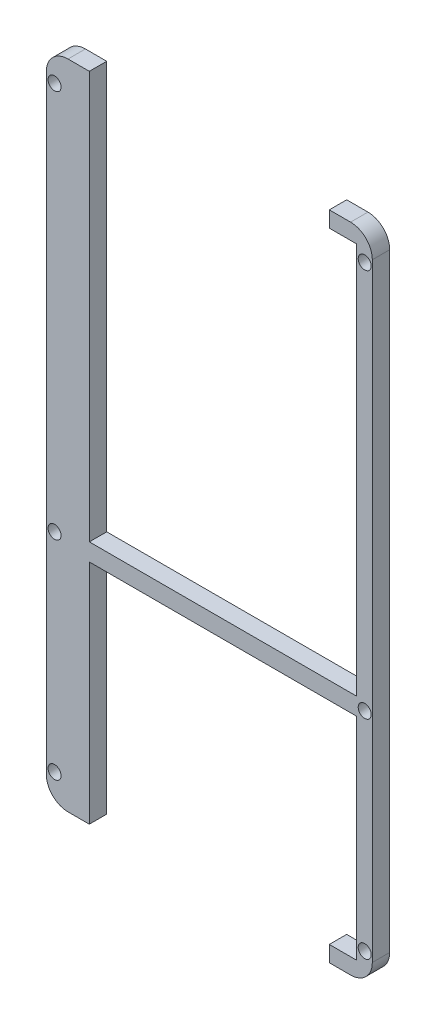
ISO-10303-21;
HEADER;
FILE_DESCRIPTION(('STEP AP214'),'2;1');
FILE_NAME('part.step','',(''),(''),'','','');
FILE_SCHEMA(('AUTOMOTIVE_DESIGN { 1 0 10303 214 1 1 1 1 }'));
ENDSEC;
DATA;
#1=APPLICATION_CONTEXT('core data for automotive mechanical design processes');
#2=APPLICATION_PROTOCOL_DEFINITION('international standard','automotive_design',2000,#1);
#3=PRODUCT_CONTEXT('',#1,'mechanical');
#4=PRODUCT('Part','Part','',(#3));
#5=PRODUCT_RELATED_PRODUCT_CATEGORY('part','',(#4));
#6=PRODUCT_DEFINITION_FORMATION('','',#4);
#7=PRODUCT_DEFINITION_CONTEXT('part definition',#1,'design');
#8=PRODUCT_DEFINITION('design','',#6,#7);
#9=PRODUCT_DEFINITION_SHAPE('','',#8);
#10=(LENGTH_UNIT() NAMED_UNIT(*) SI_UNIT(.MILLI.,.METRE.));
#11=(NAMED_UNIT(*) PLANE_ANGLE_UNIT() SI_UNIT($,.RADIAN.));
#12=(NAMED_UNIT(*) SI_UNIT($,.STERADIAN.) SOLID_ANGLE_UNIT());
#13=UNCERTAINTY_MEASURE_WITH_UNIT(LENGTH_MEASURE(1.E-05),#10,'distance_accuracy_value','');
#14=(GEOMETRIC_REPRESENTATION_CONTEXT(3) GLOBAL_UNCERTAINTY_ASSIGNED_CONTEXT((#13)) GLOBAL_UNIT_ASSIGNED_CONTEXT((#10,
#11,#12)) REPRESENTATION_CONTEXT('',''));
#15=CARTESIAN_POINT('',(0.,0.,0.));
#16=DIRECTION('',(0.,0.,1.));
#17=DIRECTION('',(1.,0.,0.));
#18=AXIS2_PLACEMENT_3D('',#15,#16,#17);
#19=CARTESIAN_POINT('',(-65.6120067040927,-435.,8.));
#20=DIRECTION('',(0.,1.,0.));
#21=DIRECTION('',(0.,0.,1.));
#22=AXIS2_PLACEMENT_3D('',#19,#20,#21);
#23=PLANE('',#22);
#24=DIRECTION('',(1.,0.,0.));
#25=VECTOR('',#24,1.);
#26=CARTESIAN_POINT('',(-65.6120067040927,-435.,8.));
#27=LINE('',#26,#25);
#28=CARTESIAN_POINT('',(-55.6120067040927,-435.,8.));
#29=VERTEX_POINT('',#28);
#30=CARTESIAN_POINT('',(-45.8120067040927,-435.,8.));
#31=VERTEX_POINT('',#30);
#32=EDGE_CURVE('E184',#29,#31,#27,.T.);
#33=ORIENTED_EDGE('',*,*,#32,.F.);
#34=DIRECTION('',(0.,0.,-1.));
#35=VECTOR('',#34,1.);
#36=CARTESIAN_POINT('',(-55.6120067040927,-435.,8.));
#37=LINE('',#36,#35);
#38=CARTESIAN_POINT('',(-55.6120067040927,-435.,0.));
#39=VERTEX_POINT('',#38);
#40=EDGE_CURVE('E248',#29,#39,#37,.T.);
#41=ORIENTED_EDGE('',*,*,#40,.T.);
#42=DIRECTION('',(1.,0.,0.));
#43=VECTOR('',#42,1.);
#44=CARTESIAN_POINT('',(-65.6120067040927,-435.,0.));
#45=LINE('',#44,#43);
#46=CARTESIAN_POINT('',(-45.8120067040927,-435.,0.));
#47=VERTEX_POINT('',#46);
#48=EDGE_CURVE('E209',#39,#47,#45,.T.);
#49=ORIENTED_EDGE('',*,*,#48,.T.);
#50=DIRECTION('',(0.,0.,-1.));
#51=VECTOR('',#50,1.);
#52=CARTESIAN_POINT('',(-45.8120067040927,-435.,8.));
#53=LINE('',#52,#51);
#54=EDGE_CURVE('E202',#31,#47,#53,.T.);
#55=ORIENTED_EDGE('',*,*,#54,.F.);
#56=EDGE_LOOP('',(#33,#41,#49,#55));
#57=FACE_BOUND('',#56,.T.);
#58=ADVANCED_FACE('F41',(#57),#23,.F.);
#59=CARTESIAN_POINT('',(-45.8120067040927,-435.,8.));
#60=DIRECTION('',(-1.,0.,0.));
#61=DIRECTION('',(0.,-1.,0.));
#62=AXIS2_PLACEMENT_3D('',#59,#60,#61);
#63=PLANE('',#62);
#64=DIRECTION('',(0.,1.,0.));
#65=VECTOR('',#64,1.);
#66=CARTESIAN_POINT('',(-45.8120067040927,-435.,0.));
#67=LINE('',#66,#65);
#68=CARTESIAN_POINT('',(-45.8120067040927,-330.5,0.));
#69=VERTEX_POINT('',#68);
#70=EDGE_CURVE('E324',#47,#69,#67,.T.);
#71=ORIENTED_EDGE('',*,*,#70,.T.);
#72=DIRECTION('',(0.,0.,-1.));
#73=VECTOR('',#72,1.);
#74=CARTESIAN_POINT('',(-45.8120067040927,-330.5,8.));
#75=LINE('',#74,#73);
#76=CARTESIAN_POINT('',(-45.8120067040927,-330.5,8.));
#77=VERTEX_POINT('',#76);
#78=EDGE_CURVE('E204',#77,#69,#75,.T.);
#79=ORIENTED_EDGE('',*,*,#78,.F.);
#80=DIRECTION('',(0.,1.,0.));
#81=VECTOR('',#80,1.);
#82=CARTESIAN_POINT('',(-45.8120067040927,-435.,8.));
#83=LINE('',#82,#81);
#84=EDGE_CURVE('E188',#31,#77,#83,.T.);
#85=ORIENTED_EDGE('',*,*,#84,.F.);
#86=ORIENTED_EDGE('',*,*,#54,.T.);
#87=EDGE_LOOP('',(#71,#79,#85,#86));
#88=FACE_BOUND('',#87,.T.);
#89=ADVANCED_FACE('F201',(#88),#63,.F.);
#90=CARTESIAN_POINT('',(-45.8120067040927,-330.5,8.));
#91=DIRECTION('',(0.,1.,0.));
#92=DIRECTION('',(0.,0.,1.));
#93=AXIS2_PLACEMENT_3D('',#90,#91,#92);
#94=PLANE('',#93);
#95=DIRECTION('',(1.,0.,0.));
#96=VECTOR('',#95,1.);
#97=CARTESIAN_POINT('',(-45.8120067040927,-330.5,0.));
#98=LINE('',#97,#96);
#99=CARTESIAN_POINT('',(77.0879932959074,-330.5,0.));
#100=VERTEX_POINT('',#99);
#101=EDGE_CURVE('E318',#69,#100,#98,.T.);
#102=ORIENTED_EDGE('',*,*,#101,.T.);
#103=DIRECTION('',(0.,0.,-1.));
#104=VECTOR('',#103,1.);
#105=CARTESIAN_POINT('',(77.0879932959074,-330.5,8.));
#106=LINE('',#105,#104);
#107=CARTESIAN_POINT('',(77.0879932959074,-330.5,8.));
#108=VERTEX_POINT('',#107);
#109=EDGE_CURVE('E215',#108,#100,#106,.T.);
#110=ORIENTED_EDGE('',*,*,#109,.F.);
#111=DIRECTION('',(1.,0.,0.));
#112=VECTOR('',#111,1.);
#113=CARTESIAN_POINT('',(-45.8120067040927,-330.5,8.));
#114=LINE('',#113,#112);
#115=EDGE_CURVE('E206',#77,#108,#114,.T.);
#116=ORIENTED_EDGE('',*,*,#115,.F.);
#117=ORIENTED_EDGE('',*,*,#78,.T.);
#118=EDGE_LOOP('',(#102,#110,#116,#117));
#119=FACE_BOUND('',#118,.T.);
#120=ADVANCED_FACE('F363',(#119),#94,.F.);
#121=CARTESIAN_POINT('',(77.0879932959074,-330.5,8.));
#122=DIRECTION('',(1.,0.,0.));
#123=DIRECTION('',(0.,0.,-1.));
#124=AXIS2_PLACEMENT_3D('',#121,#122,#123);
#125=PLANE('',#124);
#126=DIRECTION('',(0.,-1.,0.));
#127=VECTOR('',#126,1.);
#128=CARTESIAN_POINT('',(77.0879932959074,-330.5,0.));
#129=LINE('',#128,#127);
#130=CARTESIAN_POINT('',(77.0879932959074,-427.7,0.));
#131=VERTEX_POINT('',#130);
#132=EDGE_CURVE('E313',#100,#131,#129,.T.);
#133=ORIENTED_EDGE('',*,*,#132,.T.);
#134=DIRECTION('',(0.,0.,-1.));
#135=VECTOR('',#134,1.);
#136=CARTESIAN_POINT('',(77.0879932959074,-427.7,8.));
#137=LINE('',#136,#135);
#138=CARTESIAN_POINT('',(77.0879932959074,-427.7,8.));
#139=VERTEX_POINT('',#138);
#140=EDGE_CURVE('E304',#139,#131,#137,.T.);
#141=ORIENTED_EDGE('',*,*,#140,.F.);
#142=DIRECTION('',(0.,-1.,0.));
#143=VECTOR('',#142,1.);
#144=CARTESIAN_POINT('',(77.0879932959074,-330.5,8.));
#145=LINE('',#144,#143);
#146=EDGE_CURVE('E314',#108,#139,#145,.T.);
#147=ORIENTED_EDGE('',*,*,#146,.F.);
#148=ORIENTED_EDGE('',*,*,#109,.T.);
#149=EDGE_LOOP('',(#133,#141,#147,#148));
#150=FACE_BOUND('',#149,.T.);
#151=ADVANCED_FACE('F311',(#150),#125,.F.);
#152=CARTESIAN_POINT('',(77.0879932959074,-427.7,8.));
#153=DIRECTION('',(0.,-1.,0.));
#154=DIRECTION('',(0.,0.,-1.));
#155=AXIS2_PLACEMENT_3D('',#152,#153,#154);
#156=PLANE('',#155);
#157=DIRECTION('',(-1.,0.,0.));
#158=VECTOR('',#157,1.);
#159=CARTESIAN_POINT('',(77.0879932959074,-427.7,0.));
#160=LINE('',#159,#158);
#161=CARTESIAN_POINT('',(64.5879932959074,-427.7,0.));
#162=VERTEX_POINT('',#161);
#163=EDGE_CURVE('E320',#131,#162,#160,.T.);
#164=ORIENTED_EDGE('',*,*,#163,.T.);
#165=DIRECTION('',(0.,0.,-1.));
#166=VECTOR('',#165,1.);
#167=CARTESIAN_POINT('',(64.5879932959074,-427.7,8.));
#168=LINE('',#167,#166);
#169=CARTESIAN_POINT('',(64.5879932959074,-427.7,8.));
#170=VERTEX_POINT('',#169);
#171=EDGE_CURVE('E301',#170,#162,#168,.T.);
#172=ORIENTED_EDGE('',*,*,#171,.F.);
#173=DIRECTION('',(-1.,0.,0.));
#174=VECTOR('',#173,1.);
#175=CARTESIAN_POINT('',(77.0879932959074,-427.7,8.));
#176=LINE('',#175,#174);
#177=EDGE_CURVE('E365',#139,#170,#176,.T.);
#178=ORIENTED_EDGE('',*,*,#177,.F.);
#179=ORIENTED_EDGE('',*,*,#140,.T.);
#180=EDGE_LOOP('',(#164,#172,#178,#179));
#181=FACE_BOUND('',#180,.T.);
#182=ADVANCED_FACE('F398',(#181),#156,.F.);
#183=CARTESIAN_POINT('',(64.5879932959074,-427.7,8.));
#184=DIRECTION('',(1.,0.,0.));
#185=DIRECTION('',(0.,0.,-1.));
#186=AXIS2_PLACEMENT_3D('',#183,#184,#185);
#187=PLANE('',#186);
#188=DIRECTION('',(0.,-1.,0.));
#189=VECTOR('',#188,1.);
#190=CARTESIAN_POINT('',(64.5879932959074,-427.7,0.));
#191=LINE('',#190,#189);
#192=CARTESIAN_POINT('',(64.5879932959074,-435.,0.));
#193=VERTEX_POINT('',#192);
#194=EDGE_CURVE('E322',#162,#193,#191,.T.);
#195=ORIENTED_EDGE('',*,*,#194,.T.);
#196=DIRECTION('',(0.,0.,-1.));
#197=VECTOR('',#196,1.);
#198=CARTESIAN_POINT('',(64.5879932959074,-435.,8.));
#199=LINE('',#198,#197);
#200=CARTESIAN_POINT('',(64.5879932959074,-435.,8.));
#201=VERTEX_POINT('',#200);
#202=EDGE_CURVE('E298',#201,#193,#199,.T.);
#203=ORIENTED_EDGE('',*,*,#202,.F.);
#204=DIRECTION('',(0.,-1.,0.));
#205=VECTOR('',#204,1.);
#206=CARTESIAN_POINT('',(64.5879932959074,-427.7,8.));
#207=LINE('',#206,#205);
#208=EDGE_CURVE('E369',#170,#201,#207,.T.);
#209=ORIENTED_EDGE('',*,*,#208,.F.);
#210=ORIENTED_EDGE('',*,*,#171,.T.);
#211=EDGE_LOOP('',(#195,#203,#209,#210));
#212=FACE_BOUND('',#211,.T.);
#213=ADVANCED_FACE('F394',(#212),#187,.F.);
#214=CARTESIAN_POINT('',(64.5879932959074,-435.,8.));
#215=DIRECTION('',(0.,1.,0.));
#216=DIRECTION('',(0.,0.,1.));
#217=AXIS2_PLACEMENT_3D('',#214,#215,#216);
#218=PLANE('',#217);
#219=DIRECTION('',(1.,0.,0.));
#220=VECTOR('',#219,1.);
#221=CARTESIAN_POINT('',(64.5879932959074,-435.,0.));
#222=LINE('',#221,#220);
#223=CARTESIAN_POINT('',(74.3879932959073,-435.,0.));
#224=VERTEX_POINT('',#223);
#225=EDGE_CURVE('E329',#193,#224,#222,.T.);
#226=ORIENTED_EDGE('',*,*,#225,.T.);
#227=DIRECTION('',(0.,0.,-1.));
#228=VECTOR('',#227,1.);
#229=CARTESIAN_POINT('',(74.3879932959073,-435.,8.));
#230=LINE('',#229,#228);
#231=CARTESIAN_POINT('',(74.3879932959073,-435.,8.));
#232=VERTEX_POINT('',#231);
#233=EDGE_CURVE('E246',#224,#232,#230,.F.);
#234=ORIENTED_EDGE('',*,*,#233,.T.);
#235=DIRECTION('',(1.,0.,0.));
#236=VECTOR('',#235,1.);
#237=CARTESIAN_POINT('',(64.5879932959074,-435.,8.));
#238=LINE('',#237,#236);
#239=EDGE_CURVE('E371',#201,#232,#238,.T.);
#240=ORIENTED_EDGE('',*,*,#239,.F.);
#241=ORIENTED_EDGE('',*,*,#202,.T.);
#242=EDGE_LOOP('',(#226,#234,#240,#241));
#243=FACE_BOUND('',#242,.T.);
#244=ADVANCED_FACE('F389',(#243),#218,.F.);
#245=CARTESIAN_POINT('',(84.3879932959073,-135.,8.));
#246=DIRECTION('',(-1.,0.,0.));
#247=DIRECTION('',(0.,0.,1.));
#248=AXIS2_PLACEMENT_3D('',#245,#246,#247);
#249=PLANE('',#248);
#250=DIRECTION('',(0.,1.,0.));
#251=VECTOR('',#250,1.);
#252=CARTESIAN_POINT('',(84.3879932959073,-135.,0.));
#253=LINE('',#252,#251);
#254=CARTESIAN_POINT('',(84.3879932959073,-425.,0.));
#255=VERTEX_POINT('',#254);
#256=CARTESIAN_POINT('',(84.3879932959073,-145.,0.));
#257=VERTEX_POINT('',#256);
#258=EDGE_CURVE('E332',#255,#257,#253,.T.);
#259=ORIENTED_EDGE('',*,*,#258,.T.);
#260=DIRECTION('',(0.,0.,-1.));
#261=VECTOR('',#260,1.);
#262=CARTESIAN_POINT('',(84.3879932959073,-145.,8.));
#263=LINE('',#262,#261);
#264=CARTESIAN_POINT('',(84.3879932959073,-145.,8.));
#265=VERTEX_POINT('',#264);
#266=EDGE_CURVE('E244',#257,#265,#263,.F.);
#267=ORIENTED_EDGE('',*,*,#266,.T.);
#268=DIRECTION('',(0.,1.,0.));
#269=VECTOR('',#268,1.);
#270=CARTESIAN_POINT('',(84.3879932959073,-135.,8.));
#271=LINE('',#270,#269);
#272=CARTESIAN_POINT('',(84.3879932959073,-425.,8.));
#273=VERTEX_POINT('',#272);
#274=EDGE_CURVE('E350',#273,#265,#271,.T.);
#275=ORIENTED_EDGE('',*,*,#274,.F.);
#276=DIRECTION('',(0.,0.,-1.));
#277=VECTOR('',#276,1.);
#278=CARTESIAN_POINT('',(84.3879932959073,-425.,8.));
#279=LINE('',#278,#277);
#280=EDGE_CURVE('E241',#273,#255,#279,.T.);
#281=ORIENTED_EDGE('',*,*,#280,.T.);
#282=EDGE_LOOP('',(#259,#267,#275,#281));
#283=FACE_BOUND('',#282,.T.);
#284=ADVANCED_FACE('F383',(#283),#249,.F.);
#285=CARTESIAN_POINT('',(64.5879932959074,-135.,8.));
#286=DIRECTION('',(0.,-1.,0.));
#287=DIRECTION('',(0.,0.,-1.));
#288=AXIS2_PLACEMENT_3D('',#285,#286,#287);
#289=PLANE('',#288);
#290=DIRECTION('',(-1.,0.,0.));
#291=VECTOR('',#290,1.);
#292=CARTESIAN_POINT('',(64.5879932959074,-135.,8.));
#293=LINE('',#292,#291);
#294=CARTESIAN_POINT('',(74.3879932959073,-135.,8.));
#295=VERTEX_POINT('',#294);
#296=CARTESIAN_POINT('',(64.5879932959074,-135.,8.));
#297=VERTEX_POINT('',#296);
#298=EDGE_CURVE('E346',#295,#297,#293,.T.);
#299=ORIENTED_EDGE('',*,*,#298,.F.);
#300=DIRECTION('',(0.,0.,-1.));
#301=VECTOR('',#300,1.);
#302=CARTESIAN_POINT('',(74.3879932959073,-135.,8.));
#303=LINE('',#302,#301);
#304=CARTESIAN_POINT('',(74.3879932959073,-135.,0.));
#305=VERTEX_POINT('',#304);
#306=EDGE_CURVE('E238',#295,#305,#303,.T.);
#307=ORIENTED_EDGE('',*,*,#306,.T.);
#308=DIRECTION('',(-1.,0.,0.));
#309=VECTOR('',#308,1.);
#310=CARTESIAN_POINT('',(64.5879932959074,-135.,0.));
#311=LINE('',#310,#309);
#312=CARTESIAN_POINT('',(64.5879932959074,-135.,0.));
#313=VERTEX_POINT('',#312);
#314=EDGE_CURVE('E273',#305,#313,#311,.T.);
#315=ORIENTED_EDGE('',*,*,#314,.T.);
#316=DIRECTION('',(0.,0.,-1.));
#317=VECTOR('',#316,1.);
#318=CARTESIAN_POINT('',(64.5879932959074,-135.,8.));
#319=LINE('',#318,#317);
#320=EDGE_CURVE('E295',#297,#313,#319,.T.);
#321=ORIENTED_EDGE('',*,*,#320,.F.);
#322=EDGE_LOOP('',(#299,#307,#315,#321));
#323=FACE_BOUND('',#322,.T.);
#324=ADVANCED_FACE('F337',(#323),#289,.F.);
#325=CARTESIAN_POINT('',(64.5879932959074,-142.3,8.));
#326=DIRECTION('',(1.,0.,0.));
#327=DIRECTION('',(0.,0.,-1.));
#328=AXIS2_PLACEMENT_3D('',#325,#326,#327);
#329=PLANE('',#328);
#330=DIRECTION('',(0.,-1.,0.));
#331=VECTOR('',#330,1.);
#332=CARTESIAN_POINT('',(64.5879932959074,-142.3,0.));
#333=LINE('',#332,#331);
#334=CARTESIAN_POINT('',(64.5879932959074,-142.3,0.));
#335=VERTEX_POINT('',#334);
#336=EDGE_CURVE('E269',#313,#335,#333,.T.);
#337=ORIENTED_EDGE('',*,*,#336,.T.);
#338=DIRECTION('',(0.,0.,-1.));
#339=VECTOR('',#338,1.);
#340=CARTESIAN_POINT('',(64.5879932959074,-142.3,8.));
#341=LINE('',#340,#339);
#342=CARTESIAN_POINT('',(64.5879932959074,-142.3,8.));
#343=VERTEX_POINT('',#342);
#344=EDGE_CURVE('E293',#343,#335,#341,.T.);
#345=ORIENTED_EDGE('',*,*,#344,.F.);
#346=DIRECTION('',(0.,-1.,0.));
#347=VECTOR('',#346,1.);
#348=CARTESIAN_POINT('',(64.5879932959074,-142.3,8.));
#349=LINE('',#348,#347);
#350=EDGE_CURVE('E343',#297,#343,#349,.T.);
#351=ORIENTED_EDGE('',*,*,#350,.F.);
#352=ORIENTED_EDGE('',*,*,#320,.T.);
#353=EDGE_LOOP('',(#337,#345,#351,#352));
#354=FACE_BOUND('',#353,.T.);
#355=ADVANCED_FACE('F341',(#354),#329,.F.);
#356=CARTESIAN_POINT('',(77.0879932959074,-142.3,8.));
#357=DIRECTION('',(0.,1.,0.));
#358=DIRECTION('',(0.,0.,1.));
#359=AXIS2_PLACEMENT_3D('',#356,#357,#358);
#360=PLANE('',#359);
#361=DIRECTION('',(1.,0.,0.));
#362=VECTOR('',#361,1.);
#363=CARTESIAN_POINT('',(77.0879932959074,-142.3,0.));
#364=LINE('',#363,#362);
#365=CARTESIAN_POINT('',(79.0879932959074,-142.3,0.));
#366=VERTEX_POINT('',#365);
#367=EDGE_CURVE('E64',#335,#366,#364,.T.);
#368=ORIENTED_EDGE('',*,*,#367,.T.);
#369=DIRECTION('',(0.707106781186552,0.,-0.707106781186543));
#370=VECTOR('',#369,1.);
#371=CARTESIAN_POINT('',(74.0879932959074,-142.3,4.99999999999995));
#372=LINE('',#371,#370);
#373=CARTESIAN_POINT('',(77.0879932959074,-142.3,1.99999999999997));
#374=VERTEX_POINT('',#373);
#375=EDGE_CURVE('E11',#366,#374,#372,.F.);
#376=ORIENTED_EDGE('',*,*,#375,.T.);
#377=DIRECTION('',(0.,0.,-1.));
#378=VECTOR('',#377,1.);
#379=CARTESIAN_POINT('',(77.0879932959074,-142.3,8.));
#380=LINE('',#379,#378);
#381=CARTESIAN_POINT('',(77.0879932959074,-142.3,8.));
#382=VERTEX_POINT('',#381);
#383=EDGE_CURVE('E290',#382,#374,#380,.T.);
#384=ORIENTED_EDGE('',*,*,#383,.F.);
#385=DIRECTION('',(1.,0.,0.));
#386=VECTOR('',#385,1.);
#387=CARTESIAN_POINT('',(77.0879932959074,-142.3,8.));
#388=LINE('',#387,#386);
#389=EDGE_CURVE('E345',#343,#382,#388,.T.);
#390=ORIENTED_EDGE('',*,*,#389,.F.);
#391=ORIENTED_EDGE('',*,*,#344,.T.);
#392=EDGE_LOOP('',(#368,#376,#384,#390,#391));
#393=FACE_BOUND('',#392,.T.);
#394=ADVANCED_FACE('F449',(#393),#360,.F.);
#395=CARTESIAN_POINT('',(77.0879932959074,-322.5,8.));
#396=DIRECTION('',(1.,0.,0.));
#397=DIRECTION('',(0.,0.,-1.));
#398=AXIS2_PLACEMENT_3D('',#395,#396,#397);
#399=PLANE('',#398);
#400=ORIENTED_EDGE('',*,*,#383,.T.);
#401=DIRECTION('',(0.,-1.,0.));
#402=VECTOR('',#401,1.);
#403=CARTESIAN_POINT('',(77.0879932959074,-322.5,1.99999999999997));
#404=LINE('',#403,#402);
#405=CARTESIAN_POINT('',(77.0879932959074,-322.5,1.99999999999997));
#406=VERTEX_POINT('',#405);
#407=EDGE_CURVE('E250',#374,#406,#404,.T.);
#408=ORIENTED_EDGE('',*,*,#407,.T.);
#409=DIRECTION('',(0.,0.,-1.));
#410=VECTOR('',#409,1.);
#411=CARTESIAN_POINT('',(77.0879932959074,-322.5,8.));
#412=LINE('',#411,#410);
#413=CARTESIAN_POINT('',(77.0879932959074,-322.5,8.));
#414=VERTEX_POINT('',#413);
#415=EDGE_CURVE('E262',#414,#406,#412,.T.);
#416=ORIENTED_EDGE('',*,*,#415,.F.);
#417=DIRECTION('',(0.,-1.,0.));
#418=VECTOR('',#417,1.);
#419=CARTESIAN_POINT('',(77.0879932959074,-154.8,8.));
#420=LINE('',#419,#418);
#421=EDGE_CURVE('E348',#382,#414,#420,.T.);
#422=ORIENTED_EDGE('',*,*,#421,.F.);
#423=EDGE_LOOP('',(#400,#408,#416,#422));
#424=FACE_BOUND('',#423,.T.);
#425=ADVANCED_FACE('F448',(#424),#399,.F.);
#426=CARTESIAN_POINT('',(-45.8120067040927,-322.5,8.));
#427=DIRECTION('',(0.,-1.,0.));
#428=DIRECTION('',(0.,0.,-1.));
#429=AXIS2_PLACEMENT_3D('',#426,#427,#428);
#430=PLANE('',#429);
#431=DIRECTION('',(-1.,0.,0.));
#432=VECTOR('',#431,1.);
#433=CARTESIAN_POINT('',(-45.8120067040927,-322.5,0.));
#434=LINE('',#433,#432);
#435=CARTESIAN_POINT('',(79.0879932959074,-322.5,0.));
#436=VERTEX_POINT('',#435);
#437=CARTESIAN_POINT('',(-45.8120067040927,-322.5,0.));
#438=VERTEX_POINT('',#437);
#439=EDGE_CURVE('E57',#436,#438,#434,.T.);
#440=ORIENTED_EDGE('',*,*,#439,.T.);
#441=DIRECTION('',(0.,0.,-1.));
#442=VECTOR('',#441,1.);
#443=CARTESIAN_POINT('',(-45.8120067040927,-322.5,8.));
#444=LINE('',#443,#442);
#445=CARTESIAN_POINT('',(-45.8120067040927,-322.5,8.));
#446=VERTEX_POINT('',#445);
#447=EDGE_CURVE('E286',#446,#438,#444,.T.);
#448=ORIENTED_EDGE('',*,*,#447,.F.);
#449=DIRECTION('',(-1.,0.,0.));
#450=VECTOR('',#449,1.);
#451=CARTESIAN_POINT('',(-45.8120067040927,-322.5,8.));
#452=LINE('',#451,#450);
#453=EDGE_CURVE('E355',#414,#446,#452,.T.);
#454=ORIENTED_EDGE('',*,*,#453,.F.);
#455=ORIENTED_EDGE('',*,*,#415,.T.);
#456=DIRECTION('',(-0.707106781186552,0.,0.707106781186543));
#457=VECTOR('',#456,1.);
#458=CARTESIAN_POINT('',(12.6379932959065,-322.5,66.45));
#459=LINE('',#458,#457);
#460=EDGE_CURVE('E50',#406,#436,#459,.F.);
#461=ORIENTED_EDGE('',*,*,#460,.T.);
#462=EDGE_LOOP('',(#440,#448,#454,#455,#461));
#463=FACE_BOUND('',#462,.T.);
#464=ADVANCED_FACE('F257',(#463),#430,.F.);
#465=CARTESIAN_POINT('',(-45.8120067040927,-135.,8.));
#466=DIRECTION('',(-1.,0.,0.));
#467=DIRECTION('',(0.,-1.,0.));
#468=AXIS2_PLACEMENT_3D('',#465,#466,#467);
#469=PLANE('',#468);
#470=DIRECTION('',(0.,1.,0.));
#471=VECTOR('',#470,1.);
#472=CARTESIAN_POINT('',(-45.8120067040927,-135.,0.));
#473=LINE('',#472,#471);
#474=CARTESIAN_POINT('',(-45.8120067040927,-135.,0.));
#475=VERTEX_POINT('',#474);
#476=EDGE_CURVE('E271',#438,#475,#473,.T.);
#477=ORIENTED_EDGE('',*,*,#476,.T.);
#478=DIRECTION('',(0.,0.,-1.));
#479=VECTOR('',#478,1.);
#480=CARTESIAN_POINT('',(-45.8120067040927,-135.,8.));
#481=LINE('',#480,#479);
#482=CARTESIAN_POINT('',(-45.8120067040927,-135.,8.));
#483=VERTEX_POINT('',#482);
#484=EDGE_CURVE('E283',#483,#475,#481,.T.);
#485=ORIENTED_EDGE('',*,*,#484,.F.);
#486=DIRECTION('',(0.,1.,0.));
#487=VECTOR('',#486,1.);
#488=CARTESIAN_POINT('',(-45.8120067040927,-135.,8.));
#489=LINE('',#488,#487);
#490=EDGE_CURVE('E357',#446,#483,#489,.T.);
#491=ORIENTED_EDGE('',*,*,#490,.F.);
#492=ORIENTED_EDGE('',*,*,#447,.T.);
#493=EDGE_LOOP('',(#477,#485,#491,#492));
#494=FACE_BOUND('',#493,.T.);
#495=ADVANCED_FACE('F444',(#494),#469,.F.);
#496=CARTESIAN_POINT('',(-65.6120067040927,-135.,8.));
#497=DIRECTION('',(0.,-1.,0.));
#498=DIRECTION('',(0.,0.,-1.));
#499=AXIS2_PLACEMENT_3D('',#496,#497,#498);
#500=PLANE('',#499);
#501=DIRECTION('',(-1.,0.,0.));
#502=VECTOR('',#501,1.);
#503=CARTESIAN_POINT('',(-65.6120067040927,-135.,0.));
#504=LINE('',#503,#502);
#505=CARTESIAN_POINT('',(-55.6120067040927,-135.,0.));
#506=VERTEX_POINT('',#505);
#507=EDGE_CURVE('E278',#475,#506,#504,.T.);
#508=ORIENTED_EDGE('',*,*,#507,.T.);
#509=DIRECTION('',(0.,0.,-1.));
#510=VECTOR('',#509,1.);
#511=CARTESIAN_POINT('',(-55.6120067040927,-135.,8.));
#512=LINE('',#511,#510);
#513=CARTESIAN_POINT('',(-55.6120067040927,-135.,8.));
#514=VERTEX_POINT('',#513);
#515=EDGE_CURVE('E229',#506,#514,#512,.F.);
#516=ORIENTED_EDGE('',*,*,#515,.T.);
#517=DIRECTION('',(-1.,0.,0.));
#518=VECTOR('',#517,1.);
#519=CARTESIAN_POINT('',(-65.6120067040927,-135.,8.));
#520=LINE('',#519,#518);
#521=EDGE_CURVE('E359',#483,#514,#520,.T.);
#522=ORIENTED_EDGE('',*,*,#521,.F.);
#523=ORIENTED_EDGE('',*,*,#484,.T.);
#524=EDGE_LOOP('',(#508,#516,#522,#523));
#525=FACE_BOUND('',#524,.T.);
#526=ADVANCED_FACE('F439',(#525),#500,.F.);
#527=CARTESIAN_POINT('',(-65.6120067040927,-435.,8.));
#528=DIRECTION('',(1.,0.,0.));
#529=DIRECTION('',(0.,0.,-1.));
#530=AXIS2_PLACEMENT_3D('',#527,#528,#529);
#531=PLANE('',#530);
#532=DIRECTION('',(0.,-1.,0.));
#533=VECTOR('',#532,1.);
#534=CARTESIAN_POINT('',(-65.6120067040927,-435.,8.));
#535=LINE('',#534,#533);
#536=CARTESIAN_POINT('',(-65.6120067040927,-145.,8.));
#537=VERTEX_POINT('',#536);
#538=CARTESIAN_POINT('',(-65.6120067040927,-425.,8.));
#539=VERTEX_POINT('',#538);
#540=EDGE_CURVE('E287',#537,#539,#535,.T.);
#541=ORIENTED_EDGE('',*,*,#540,.F.);
#542=DIRECTION('',(0.,0.,-1.));
#543=VECTOR('',#542,1.);
#544=CARTESIAN_POINT('',(-65.6120067040927,-145.,8.));
#545=LINE('',#544,#543);
#546=CARTESIAN_POINT('',(-65.6120067040927,-145.,0.));
#547=VERTEX_POINT('',#546);
#548=EDGE_CURVE('E213',#537,#547,#545,.T.);
#549=ORIENTED_EDGE('',*,*,#548,.T.);
#550=DIRECTION('',(0.,-1.,0.));
#551=VECTOR('',#550,1.);
#552=CARTESIAN_POINT('',(-65.6120067040927,-435.,0.));
#553=LINE('',#552,#551);
#554=CARTESIAN_POINT('',(-65.6120067040927,-425.,0.));
#555=VERTEX_POINT('',#554);
#556=EDGE_CURVE('E197',#547,#555,#553,.T.);
#557=ORIENTED_EDGE('',*,*,#556,.T.);
#558=DIRECTION('',(0.,0.,-1.));
#559=VECTOR('',#558,1.);
#560=CARTESIAN_POINT('',(-65.6120067040927,-425.,8.));
#561=LINE('',#560,#559);
#562=EDGE_CURVE('E211',#555,#539,#561,.F.);
#563=ORIENTED_EDGE('',*,*,#562,.T.);
#564=EDGE_LOOP('',(#541,#549,#557,#563));
#565=FACE_BOUND('',#564,.T.);
#566=ADVANCED_FACE('F433',(#565),#531,.F.);
#567=CARTESIAN_POINT('',(0.,0.,8.));
#568=DIRECTION('',(0.,0.,1.));
#569=DIRECTION('',(1.,0.,0.));
#570=AXIS2_PLACEMENT_3D('',#567,#568,#569);
#571=PLANE('',#570);
#572=CARTESIAN_POINT('',(-61.8120067040927,-147.8,8.));
#573=DIRECTION('',(0.,0.,1.));
#574=DIRECTION('',(1.,0.,0.));
#575=AXIS2_PLACEMENT_3D('',#572,#573,#574);
#576=CIRCLE('',#575,3.);
#577=CARTESIAN_POINT('',(-58.8120067040927,-147.8,8.));
#578=VERTEX_POINT('',#577);
#579=EDGE_CURVE('E996',#578,#578,#576,.T.);
#580=ORIENTED_EDGE('',*,*,#579,.F.);
#581=EDGE_LOOP('',(#580));
#582=FACE_BOUND('',#581,.T.);
#583=CARTESIAN_POINT('',(-61.8120067040927,-326.5,8.));
#584=DIRECTION('',(0.,0.,1.));
#585=DIRECTION('',(1.,0.,0.));
#586=AXIS2_PLACEMENT_3D('',#583,#584,#585);
#587=CIRCLE('',#586,3.);
#588=CARTESIAN_POINT('',(-58.8120067040927,-326.5,8.));
#589=VERTEX_POINT('',#588);
#590=EDGE_CURVE('E1003',#589,#589,#587,.T.);
#591=ORIENTED_EDGE('',*,*,#590,.F.);
#592=EDGE_LOOP('',(#591));
#593=FACE_BOUND('',#592,.T.);
#594=CARTESIAN_POINT('',(80.8879932959073,-326.5,8.));
#595=DIRECTION('',(0.,0.,1.));
#596=DIRECTION('',(1.,0.,0.));
#597=AXIS2_PLACEMENT_3D('',#594,#595,#596);
#598=CIRCLE('',#597,3.00000000000001);
#599=CARTESIAN_POINT('',(83.8879932959073,-326.5,8.));
#600=VERTEX_POINT('',#599);
#601=EDGE_CURVE('E1009',#600,#600,#598,.T.);
#602=ORIENTED_EDGE('',*,*,#601,.F.);
#603=EDGE_LOOP('',(#602));
#604=FACE_BOUND('',#603,.T.);
#605=CARTESIAN_POINT('',(80.8879932959073,-422.2,8.));
#606=DIRECTION('',(0.,0.,1.));
#607=DIRECTION('',(1.,0.,0.));
#608=AXIS2_PLACEMENT_3D('',#605,#606,#607);
#609=CIRCLE('',#608,3.00000000000001);
#610=CARTESIAN_POINT('',(83.8879932959073,-422.2,8.));
#611=VERTEX_POINT('',#610);
#612=EDGE_CURVE('E1015',#611,#611,#609,.T.);
#613=ORIENTED_EDGE('',*,*,#612,.F.);
#614=EDGE_LOOP('',(#613));
#615=FACE_BOUND('',#614,.T.);
#616=CARTESIAN_POINT('',(-61.8120067040927,-422.2,8.));
#617=DIRECTION('',(0.,0.,1.));
#618=DIRECTION('',(1.,0.,0.));
#619=AXIS2_PLACEMENT_3D('',#616,#617,#618);
#620=CIRCLE('',#619,3.);
#621=CARTESIAN_POINT('',(-58.8120067040927,-422.2,8.));
#622=VERTEX_POINT('',#621);
#623=EDGE_CURVE('E990',#622,#622,#620,.T.);
#624=ORIENTED_EDGE('',*,*,#623,.F.);
#625=EDGE_LOOP('',(#624));
#626=FACE_BOUND('',#625,.T.);
#627=CARTESIAN_POINT('',(80.8879932959073,-147.8,8.));
#628=DIRECTION('',(0.,0.,1.));
#629=DIRECTION('',(1.,0.,0.));
#630=AXIS2_PLACEMENT_3D('',#627,#628,#629);
#631=CIRCLE('',#630,3.00000000000001);
#632=CARTESIAN_POINT('',(83.8879932959073,-147.8,8.));
#633=VERTEX_POINT('',#632);
#634=EDGE_CURVE('E999',#633,#633,#631,.T.);
#635=ORIENTED_EDGE('',*,*,#634,.F.);
#636=EDGE_LOOP('',(#635));
#637=FACE_BOUND('',#636,.T.);
#638=ORIENTED_EDGE('',*,*,#521,.T.);
#639=CARTESIAN_POINT('',(-55.6120067040927,-145.,8.));
#640=DIRECTION('',(0.,0.,1.));
#641=DIRECTION('',(1.,0.,0.));
#642=AXIS2_PLACEMENT_3D('',#639,#640,#641);
#643=CIRCLE('',#642,10.);
#644=EDGE_CURVE('E236',#514,#537,#643,.T.);
#645=ORIENTED_EDGE('',*,*,#644,.T.);
#646=ORIENTED_EDGE('',*,*,#540,.T.);
#647=CARTESIAN_POINT('',(-55.6120067040927,-425.,8.));
#648=DIRECTION('',(0.,0.,1.));
#649=DIRECTION('',(1.,0.,0.));
#650=AXIS2_PLACEMENT_3D('',#647,#648,#649);
#651=CIRCLE('',#650,10.);
#652=EDGE_CURVE('E192',#539,#29,#651,.T.);
#653=ORIENTED_EDGE('',*,*,#652,.T.);
#654=ORIENTED_EDGE('',*,*,#32,.T.);
#655=ORIENTED_EDGE('',*,*,#84,.T.);
#656=ORIENTED_EDGE('',*,*,#115,.T.);
#657=ORIENTED_EDGE('',*,*,#146,.T.);
#658=ORIENTED_EDGE('',*,*,#177,.T.);
#659=ORIENTED_EDGE('',*,*,#208,.T.);
#660=ORIENTED_EDGE('',*,*,#239,.T.);
#661=CARTESIAN_POINT('',(74.3879932959073,-425.,8.));
#662=DIRECTION('',(0.,0.,1.));
#663=DIRECTION('',(1.,0.,0.));
#664=AXIS2_PLACEMENT_3D('',#661,#662,#663);
#665=CIRCLE('',#664,10.);
#666=EDGE_CURVE('E232',#232,#273,#665,.T.);
#667=ORIENTED_EDGE('',*,*,#666,.T.);
#668=ORIENTED_EDGE('',*,*,#274,.T.);
#669=CARTESIAN_POINT('',(74.3879932959073,-145.,8.));
#670=DIRECTION('',(0.,0.,1.));
#671=DIRECTION('',(1.,0.,0.));
#672=AXIS2_PLACEMENT_3D('',#669,#670,#671);
#673=CIRCLE('',#672,10.);
#674=EDGE_CURVE('E234',#265,#295,#673,.T.);
#675=ORIENTED_EDGE('',*,*,#674,.T.);
#676=ORIENTED_EDGE('',*,*,#298,.T.);
#677=ORIENTED_EDGE('',*,*,#350,.T.);
#678=ORIENTED_EDGE('',*,*,#389,.T.);
#679=ORIENTED_EDGE('',*,*,#421,.T.);
#680=ORIENTED_EDGE('',*,*,#453,.T.);
#681=ORIENTED_EDGE('',*,*,#490,.T.);
#682=EDGE_LOOP('',(#638,#645,#646,#653,#654,#655,#656,#657,#658,#659,#660,#667,#668,#675,#676,
#677,#678,#679,#680,#681));
#683=FACE_BOUND('',#682,.T.);
#684=ADVANCED_FACE('F187',(#582,#593,#604,#615,#626,#637,#683),#571,.T.);
#685=CARTESIAN_POINT('',(0.,0.,0.));
#686=DIRECTION('',(0.,0.,1.));
#687=DIRECTION('',(1.,0.,0.));
#688=AXIS2_PLACEMENT_3D('',#685,#686,#687);
#689=PLANE('',#688);
#690=CARTESIAN_POINT('',(80.8879932959073,-422.2,0.));
#691=DIRECTION('',(0.,0.,1.));
#692=DIRECTION('',(1.,0.,0.));
#693=AXIS2_PLACEMENT_3D('',#690,#691,#692);
#694=CIRCLE('',#693,1.75);
#695=CARTESIAN_POINT('',(82.6379932959073,-422.2,0.));
#696=VERTEX_POINT('',#695);
#697=EDGE_CURVE('E958',#696,#696,#694,.T.);
#698=ORIENTED_EDGE('',*,*,#697,.T.);
#699=EDGE_LOOP('',(#698));
#700=FACE_BOUND('',#699,.T.);
#701=CARTESIAN_POINT('',(-61.8120067040927,-326.5,0.));
#702=DIRECTION('',(0.,0.,1.));
#703=DIRECTION('',(1.,0.,0.));
#704=AXIS2_PLACEMENT_3D('',#701,#702,#703);
#705=CIRCLE('',#704,1.75);
#706=CARTESIAN_POINT('',(-60.0620067040927,-326.5,0.));
#707=VERTEX_POINT('',#706);
#708=EDGE_CURVE('E962',#707,#707,#705,.T.);
#709=ORIENTED_EDGE('',*,*,#708,.T.);
#710=EDGE_LOOP('',(#709));
#711=FACE_BOUND('',#710,.T.);
#712=CARTESIAN_POINT('',(80.8879932959073,-326.5,0.));
#713=DIRECTION('',(0.,0.,1.));
#714=DIRECTION('',(1.,0.,0.));
#715=AXIS2_PLACEMENT_3D('',#712,#713,#714);
#716=CIRCLE('',#715,1.75);
#717=CARTESIAN_POINT('',(82.6379932959073,-326.5,0.));
#718=VERTEX_POINT('',#717);
#719=EDGE_CURVE('E981',#718,#718,#716,.T.);
#720=ORIENTED_EDGE('',*,*,#719,.T.);
#721=EDGE_LOOP('',(#720));
#722=FACE_BOUND('',#721,.T.);
#723=CARTESIAN_POINT('',(80.8879932959073,-147.8,0.));
#724=DIRECTION('',(0.,0.,1.));
#725=DIRECTION('',(1.,0.,0.));
#726=AXIS2_PLACEMENT_3D('',#723,#724,#725);
#727=CIRCLE('',#726,1.75);
#728=CARTESIAN_POINT('',(82.6379932959073,-147.8,0.));
#729=VERTEX_POINT('',#728);
#730=EDGE_CURVE('E975',#729,#729,#727,.T.);
#731=ORIENTED_EDGE('',*,*,#730,.T.);
#732=EDGE_LOOP('',(#731));
#733=FACE_BOUND('',#732,.T.);
#734=CARTESIAN_POINT('',(-61.8120067040927,-422.2,0.));
#735=DIRECTION('',(0.,0.,1.));
#736=DIRECTION('',(1.,0.,0.));
#737=AXIS2_PLACEMENT_3D('',#734,#735,#736);
#738=CIRCLE('',#737,1.75);
#739=CARTESIAN_POINT('',(-60.0620067040927,-422.2,0.));
#740=VERTEX_POINT('',#739);
#741=EDGE_CURVE('E1062',#740,#740,#738,.T.);
#742=ORIENTED_EDGE('',*,*,#741,.T.);
#743=EDGE_LOOP('',(#742));
#744=FACE_BOUND('',#743,.T.);
#745=CARTESIAN_POINT('',(-61.8120067040927,-147.8,0.));
#746=DIRECTION('',(0.,0.,1.));
#747=DIRECTION('',(1.,0.,0.));
#748=AXIS2_PLACEMENT_3D('',#745,#746,#747);
#749=CIRCLE('',#748,1.75);
#750=CARTESIAN_POINT('',(-60.0620067040927,-147.8,0.));
#751=VERTEX_POINT('',#750);
#752=EDGE_CURVE('E984',#751,#751,#749,.T.);
#753=ORIENTED_EDGE('',*,*,#752,.T.);
#754=EDGE_LOOP('',(#753));
#755=FACE_BOUND('',#754,.T.);
#756=ORIENTED_EDGE('',*,*,#439,.F.);
#757=DIRECTION('',(0.,1.,0.));
#758=VECTOR('',#757,1.);
#759=CARTESIAN_POINT('',(79.0879932959074,0.,0.));
#760=LINE('',#759,#758);
#761=EDGE_CURVE('E253',#436,#366,#760,.T.);
#762=ORIENTED_EDGE('',*,*,#761,.T.);
#763=ORIENTED_EDGE('',*,*,#367,.F.);
#764=ORIENTED_EDGE('',*,*,#336,.F.);
#765=ORIENTED_EDGE('',*,*,#314,.F.);
#766=CARTESIAN_POINT('',(74.3879932959073,-145.,0.));
#767=DIRECTION('',(0.,0.,1.));
#768=DIRECTION('',(1.,0.,0.));
#769=AXIS2_PLACEMENT_3D('',#766,#767,#768);
#770=CIRCLE('',#769,10.);
#771=EDGE_CURVE('E225',#305,#257,#770,.F.);
#772=ORIENTED_EDGE('',*,*,#771,.T.);
#773=ORIENTED_EDGE('',*,*,#258,.F.);
#774=CARTESIAN_POINT('',(74.3879932959073,-425.,0.));
#775=DIRECTION('',(0.,0.,1.));
#776=DIRECTION('',(1.,0.,0.));
#777=AXIS2_PLACEMENT_3D('',#774,#775,#776);
#778=CIRCLE('',#777,10.);
#779=EDGE_CURVE('E223',#255,#224,#778,.F.);
#780=ORIENTED_EDGE('',*,*,#779,.T.);
#781=ORIENTED_EDGE('',*,*,#225,.F.);
#782=ORIENTED_EDGE('',*,*,#194,.F.);
#783=ORIENTED_EDGE('',*,*,#163,.F.);
#784=ORIENTED_EDGE('',*,*,#132,.F.);
#785=ORIENTED_EDGE('',*,*,#101,.F.);
#786=ORIENTED_EDGE('',*,*,#70,.F.);
#787=ORIENTED_EDGE('',*,*,#48,.F.);
#788=CARTESIAN_POINT('',(-55.6120067040927,-425.,0.));
#789=DIRECTION('',(0.,0.,1.));
#790=DIRECTION('',(1.,0.,0.));
#791=AXIS2_PLACEMENT_3D('',#788,#789,#790);
#792=CIRCLE('',#791,10.);
#793=EDGE_CURVE('E221',#39,#555,#792,.F.);
#794=ORIENTED_EDGE('',*,*,#793,.T.);
#795=ORIENTED_EDGE('',*,*,#556,.F.);
#796=CARTESIAN_POINT('',(-55.6120067040927,-145.,0.));
#797=DIRECTION('',(0.,0.,1.));
#798=DIRECTION('',(1.,0.,0.));
#799=AXIS2_PLACEMENT_3D('',#796,#797,#798);
#800=CIRCLE('',#799,10.);
#801=EDGE_CURVE('E227',#547,#506,#800,.F.);
#802=ORIENTED_EDGE('',*,*,#801,.T.);
#803=ORIENTED_EDGE('',*,*,#507,.F.);
#804=ORIENTED_EDGE('',*,*,#476,.F.);
#805=EDGE_LOOP('',(#756,#762,#763,#764,#765,#772,#773,#780,#781,#782,#783,#784,#785,#786,#787,
#794,#795,#802,#803,#804));
#806=FACE_BOUND('',#805,.T.);
#807=ADVANCED_FACE('F266',(#700,#711,#722,#733,#744,#755,#806),#689,.F.);
#808=CARTESIAN_POINT('',(80.8879932959073,-147.8,3.));
#809=DIRECTION('',(0.,0.,1.));
#810=DIRECTION('',(1.,0.,0.));
#811=AXIS2_PLACEMENT_3D('',#808,#809,#810);
#812=CYLINDRICAL_SURFACE('',#811,3.00000000000001);
#813=CARTESIAN_POINT('',(80.8879932959073,-147.8,3.));
#814=DIRECTION('',(0.,0.,1.));
#815=DIRECTION('',(1.,0.,0.));
#816=AXIS2_PLACEMENT_3D('',#813,#814,#815);
#817=CIRCLE('',#816,3.00000000000001);
#818=CARTESIAN_POINT('',(83.8879932959073,-147.8,3.));
#819=VERTEX_POINT('',#818);
#820=EDGE_CURVE('E362',#819,#819,#817,.T.);
#821=ORIENTED_EDGE('',*,*,#820,.F.);
#822=EDGE_LOOP('',(#821));
#823=FACE_BOUND('',#822,.T.);
#824=ORIENTED_EDGE('',*,*,#634,.T.);
#825=EDGE_LOOP('',(#824));
#826=FACE_BOUND('',#825,.T.);
#827=ADVANCED_FACE('F544',(#823,#826),#812,.F.);
#828=CARTESIAN_POINT('',(80.8879932959073,-147.8,3.));
#829=DIRECTION('',(0.,0.,1.));
#830=DIRECTION('',(1.,0.,0.));
#831=AXIS2_PLACEMENT_3D('',#828,#829,#830);
#832=PLANE('',#831);
#833=CARTESIAN_POINT('',(80.8879932959073,-147.8,3.));
#834=DIRECTION('',(0.,0.,1.));
#835=DIRECTION('',(1.,0.,0.));
#836=AXIS2_PLACEMENT_3D('',#833,#834,#835);
#837=CIRCLE('',#836,1.75);
#838=CARTESIAN_POINT('',(82.6379932959073,-147.8,3.));
#839=VERTEX_POINT('',#838);
#840=EDGE_CURVE('E971',#839,#839,#837,.T.);
#841=ORIENTED_EDGE('',*,*,#840,.F.);
#842=EDGE_LOOP('',(#841));
#843=FACE_BOUND('',#842,.T.);
#844=ORIENTED_EDGE('',*,*,#820,.T.);
#845=EDGE_LOOP('',(#844));
#846=FACE_BOUND('',#845,.T.);
#847=ADVANCED_FACE('F554',(#843,#846),#832,.T.);
#848=CARTESIAN_POINT('',(-61.8120067040927,-422.2,3.));
#849=DIRECTION('',(0.,0.,1.));
#850=DIRECTION('',(1.,0.,0.));
#851=AXIS2_PLACEMENT_3D('',#848,#849,#850);
#852=CYLINDRICAL_SURFACE('',#851,3.);
#853=CARTESIAN_POINT('',(-61.8120067040927,-422.2,3.));
#854=DIRECTION('',(0.,0.,1.));
#855=DIRECTION('',(1.,0.,0.));
#856=AXIS2_PLACEMENT_3D('',#853,#854,#855);
#857=CIRCLE('',#856,3.);
#858=CARTESIAN_POINT('',(-58.8120067040927,-422.2,3.));
#859=VERTEX_POINT('',#858);
#860=EDGE_CURVE('E987',#859,#859,#857,.T.);
#861=ORIENTED_EDGE('',*,*,#860,.F.);
#862=EDGE_LOOP('',(#861));
#863=FACE_BOUND('',#862,.T.);
#864=ORIENTED_EDGE('',*,*,#623,.T.);
#865=EDGE_LOOP('',(#864));
#866=FACE_BOUND('',#865,.T.);
#867=ADVANCED_FACE('F565',(#863,#866),#852,.F.);
#868=CARTESIAN_POINT('',(-61.8120067040927,-422.2,3.));
#869=DIRECTION('',(0.,0.,1.));
#870=DIRECTION('',(1.,0.,0.));
#871=AXIS2_PLACEMENT_3D('',#868,#869,#870);
#872=PLANE('',#871);
#873=CARTESIAN_POINT('',(-61.8120067040927,-422.2,3.));
#874=DIRECTION('',(0.,0.,1.));
#875=DIRECTION('',(1.,0.,0.));
#876=AXIS2_PLACEMENT_3D('',#873,#874,#875);
#877=CIRCLE('',#876,1.75);
#878=CARTESIAN_POINT('',(-60.0620067040927,-422.2,3.));
#879=VERTEX_POINT('',#878);
#880=EDGE_CURVE('E967',#879,#879,#877,.T.);
#881=ORIENTED_EDGE('',*,*,#880,.F.);
#882=EDGE_LOOP('',(#881));
#883=FACE_BOUND('',#882,.T.);
#884=ORIENTED_EDGE('',*,*,#860,.T.);
#885=EDGE_LOOP('',(#884));
#886=FACE_BOUND('',#885,.T.);
#887=ADVANCED_FACE('F576',(#883,#886),#872,.T.);
#888=CARTESIAN_POINT('',(80.8879932959073,-422.2,3.));
#889=DIRECTION('',(0.,0.,1.));
#890=DIRECTION('',(1.,0.,0.));
#891=AXIS2_PLACEMENT_3D('',#888,#889,#890);
#892=CYLINDRICAL_SURFACE('',#891,3.00000000000001);
#893=CARTESIAN_POINT('',(80.8879932959073,-422.2,3.));
#894=DIRECTION('',(0.,0.,1.));
#895=DIRECTION('',(1.,0.,0.));
#896=AXIS2_PLACEMENT_3D('',#893,#894,#895);
#897=CIRCLE('',#896,3.00000000000001);
#898=CARTESIAN_POINT('',(83.8879932959073,-422.2,3.));
#899=VERTEX_POINT('',#898);
#900=EDGE_CURVE('E993',#899,#899,#897,.T.);
#901=ORIENTED_EDGE('',*,*,#900,.F.);
#902=EDGE_LOOP('',(#901));
#903=FACE_BOUND('',#902,.T.);
#904=ORIENTED_EDGE('',*,*,#612,.T.);
#905=EDGE_LOOP('',(#904));
#906=FACE_BOUND('',#905,.T.);
#907=ADVANCED_FACE('F586',(#903,#906),#892,.F.);
#908=CARTESIAN_POINT('',(80.8879932959073,-422.2,3.));
#909=DIRECTION('',(0.,0.,1.));
#910=DIRECTION('',(1.,0.,0.));
#911=AXIS2_PLACEMENT_3D('',#908,#909,#910);
#912=PLANE('',#911);
#913=CARTESIAN_POINT('',(80.8879932959073,-422.2,3.));
#914=DIRECTION('',(0.,0.,1.));
#915=DIRECTION('',(1.,0.,0.));
#916=AXIS2_PLACEMENT_3D('',#913,#914,#915);
#917=CIRCLE('',#916,1.75);
#918=CARTESIAN_POINT('',(82.6379932959073,-422.2,3.));
#919=VERTEX_POINT('',#918);
#920=EDGE_CURVE('E961',#919,#919,#917,.T.);
#921=ORIENTED_EDGE('',*,*,#920,.F.);
#922=EDGE_LOOP('',(#921));
#923=FACE_BOUND('',#922,.T.);
#924=ORIENTED_EDGE('',*,*,#900,.T.);
#925=EDGE_LOOP('',(#924));
#926=FACE_BOUND('',#925,.T.);
#927=ADVANCED_FACE('F596',(#923,#926),#912,.T.);
#928=CARTESIAN_POINT('',(80.8879932959073,-326.5,3.));
#929=DIRECTION('',(0.,0.,1.));
#930=DIRECTION('',(1.,0.,0.));
#931=AXIS2_PLACEMENT_3D('',#928,#929,#930);
#932=CYLINDRICAL_SURFACE('',#931,3.00000000000001);
#933=CARTESIAN_POINT('',(80.8879932959073,-326.5,3.));
#934=DIRECTION('',(0.,0.,1.));
#935=DIRECTION('',(1.,0.,0.));
#936=AXIS2_PLACEMENT_3D('',#933,#934,#935);
#937=CIRCLE('',#936,3.00000000000001);
#938=CARTESIAN_POINT('',(83.8879932959073,-326.5,3.));
#939=VERTEX_POINT('',#938);
#940=EDGE_CURVE('E1012',#939,#939,#937,.T.);
#941=ORIENTED_EDGE('',*,*,#940,.F.);
#942=EDGE_LOOP('',(#941));
#943=FACE_BOUND('',#942,.T.);
#944=ORIENTED_EDGE('',*,*,#601,.T.);
#945=EDGE_LOOP('',(#944));
#946=FACE_BOUND('',#945,.T.);
#947=ADVANCED_FACE('F606',(#943,#946),#932,.F.);
#948=CARTESIAN_POINT('',(80.8879932959073,-326.5,3.));
#949=DIRECTION('',(0.,0.,1.));
#950=DIRECTION('',(1.,0.,0.));
#951=AXIS2_PLACEMENT_3D('',#948,#949,#950);
#952=PLANE('',#951);
#953=CARTESIAN_POINT('',(80.8879932959073,-326.5,3.));
#954=DIRECTION('',(0.,0.,1.));
#955=DIRECTION('',(1.,0.,0.));
#956=AXIS2_PLACEMENT_3D('',#953,#954,#955);
#957=CIRCLE('',#956,1.75);
#958=CARTESIAN_POINT('',(82.6379932959073,-326.5,3.));
#959=VERTEX_POINT('',#958);
#960=EDGE_CURVE('E978',#959,#959,#957,.T.);
#961=ORIENTED_EDGE('',*,*,#960,.F.);
#962=EDGE_LOOP('',(#961));
#963=FACE_BOUND('',#962,.T.);
#964=ORIENTED_EDGE('',*,*,#940,.T.);
#965=EDGE_LOOP('',(#964));
#966=FACE_BOUND('',#965,.T.);
#967=ADVANCED_FACE('F616',(#963,#966),#952,.T.);
#968=CARTESIAN_POINT('',(-61.8120067040927,-326.5,3.));
#969=DIRECTION('',(0.,0.,1.));
#970=DIRECTION('',(1.,0.,0.));
#971=AXIS2_PLACEMENT_3D('',#968,#969,#970);
#972=CYLINDRICAL_SURFACE('',#971,3.);
#973=CARTESIAN_POINT('',(-61.8120067040927,-326.5,3.));
#974=DIRECTION('',(0.,0.,1.));
#975=DIRECTION('',(1.,0.,0.));
#976=AXIS2_PLACEMENT_3D('',#973,#974,#975);
#977=CIRCLE('',#976,3.);
#978=CARTESIAN_POINT('',(-58.8120067040927,-326.5,3.));
#979=VERTEX_POINT('',#978);
#980=EDGE_CURVE('E1006',#979,#979,#977,.T.);
#981=ORIENTED_EDGE('',*,*,#980,.F.);
#982=EDGE_LOOP('',(#981));
#983=FACE_BOUND('',#982,.T.);
#984=ORIENTED_EDGE('',*,*,#590,.T.);
#985=EDGE_LOOP('',(#984));
#986=FACE_BOUND('',#985,.T.);
#987=ADVANCED_FACE('F626',(#983,#986),#972,.F.);
#988=CARTESIAN_POINT('',(-61.8120067040927,-326.5,3.));
#989=DIRECTION('',(0.,0.,1.));
#990=DIRECTION('',(1.,0.,0.));
#991=AXIS2_PLACEMENT_3D('',#988,#989,#990);
#992=PLANE('',#991);
#993=CARTESIAN_POINT('',(-61.8120067040927,-326.5,3.));
#994=DIRECTION('',(0.,0.,1.));
#995=DIRECTION('',(1.,0.,0.));
#996=AXIS2_PLACEMENT_3D('',#993,#994,#995);
#997=CIRCLE('',#996,1.75);
#998=CARTESIAN_POINT('',(-60.0620067040927,-326.5,3.));
#999=VERTEX_POINT('',#998);
#1000=EDGE_CURVE('E965',#999,#999,#997,.T.);
#1001=ORIENTED_EDGE('',*,*,#1000,.F.);
#1002=EDGE_LOOP('',(#1001));
#1003=FACE_BOUND('',#1002,.T.);
#1004=ORIENTED_EDGE('',*,*,#980,.T.);
#1005=EDGE_LOOP('',(#1004));
#1006=FACE_BOUND('',#1005,.T.);
#1007=ADVANCED_FACE('F636',(#1003,#1006),#992,.T.);
#1008=CARTESIAN_POINT('',(-61.8120067040927,-147.8,3.));
#1009=DIRECTION('',(0.,0.,1.));
#1010=DIRECTION('',(1.,0.,0.));
#1011=AXIS2_PLACEMENT_3D('',#1008,#1009,#1010);
#1012=CYLINDRICAL_SURFACE('',#1011,3.);
#1013=CARTESIAN_POINT('',(-61.8120067040927,-147.8,3.));
#1014=DIRECTION('',(0.,0.,1.));
#1015=DIRECTION('',(1.,0.,0.));
#1016=AXIS2_PLACEMENT_3D('',#1013,#1014,#1015);
#1017=CIRCLE('',#1016,3.);
#1018=CARTESIAN_POINT('',(-58.8120067040927,-147.8,3.));
#1019=VERTEX_POINT('',#1018);
#1020=EDGE_CURVE('E1000',#1019,#1019,#1017,.T.);
#1021=ORIENTED_EDGE('',*,*,#1020,.F.);
#1022=EDGE_LOOP('',(#1021));
#1023=FACE_BOUND('',#1022,.T.);
#1024=ORIENTED_EDGE('',*,*,#579,.T.);
#1025=EDGE_LOOP('',(#1024));
#1026=FACE_BOUND('',#1025,.T.);
#1027=ADVANCED_FACE('F645',(#1023,#1026),#1012,.F.);
#1028=CARTESIAN_POINT('',(-61.8120067040927,-147.8,3.));
#1029=DIRECTION('',(0.,0.,1.));
#1030=DIRECTION('',(1.,0.,0.));
#1031=AXIS2_PLACEMENT_3D('',#1028,#1029,#1030);
#1032=PLANE('',#1031);
#1033=CARTESIAN_POINT('',(-61.8120067040927,-147.8,3.));
#1034=DIRECTION('',(0.,0.,1.));
#1035=DIRECTION('',(1.,0.,0.));
#1036=AXIS2_PLACEMENT_3D('',#1033,#1034,#1035);
#1037=CIRCLE('',#1036,1.75);
#1038=CARTESIAN_POINT('',(-60.0620067040927,-147.8,3.));
#1039=VERTEX_POINT('',#1038);
#1040=EDGE_CURVE('E974',#1039,#1039,#1037,.T.);
#1041=ORIENTED_EDGE('',*,*,#1040,.F.);
#1042=EDGE_LOOP('',(#1041));
#1043=FACE_BOUND('',#1042,.T.);
#1044=ORIENTED_EDGE('',*,*,#1020,.T.);
#1045=EDGE_LOOP('',(#1044));
#1046=FACE_BOUND('',#1045,.T.);
#1047=ADVANCED_FACE('F655',(#1043,#1046),#1032,.T.);
#1048=CARTESIAN_POINT('',(-61.8120067040927,-147.8,0.));
#1049=DIRECTION('',(0.,0.,1.));
#1050=DIRECTION('',(1.,0.,0.));
#1051=AXIS2_PLACEMENT_3D('',#1048,#1049,#1050);
#1052=CYLINDRICAL_SURFACE('',#1051,1.75);
#1053=ORIENTED_EDGE('',*,*,#752,.F.);
#1054=EDGE_LOOP('',(#1053));
#1055=FACE_BOUND('',#1054,.T.);
#1056=ORIENTED_EDGE('',*,*,#1040,.T.);
#1057=EDGE_LOOP('',(#1056));
#1058=FACE_BOUND('',#1057,.T.);
#1059=ADVANCED_FACE('F664',(#1055,#1058),#1052,.F.);
#1060=CARTESIAN_POINT('',(-61.8120067040927,-422.2,0.));
#1061=DIRECTION('',(0.,0.,1.));
#1062=DIRECTION('',(1.,0.,0.));
#1063=AXIS2_PLACEMENT_3D('',#1060,#1061,#1062);
#1064=CYLINDRICAL_SURFACE('',#1063,1.75);
#1065=ORIENTED_EDGE('',*,*,#741,.F.);
#1066=EDGE_LOOP('',(#1065));
#1067=FACE_BOUND('',#1066,.T.);
#1068=ORIENTED_EDGE('',*,*,#880,.T.);
#1069=EDGE_LOOP('',(#1068));
#1070=FACE_BOUND('',#1069,.T.);
#1071=ADVANCED_FACE('F674',(#1067,#1070),#1064,.F.);
#1072=CARTESIAN_POINT('',(80.8879932959073,-147.8,0.));
#1073=DIRECTION('',(0.,0.,1.));
#1074=DIRECTION('',(1.,0.,0.));
#1075=AXIS2_PLACEMENT_3D('',#1072,#1073,#1074);
#1076=CYLINDRICAL_SURFACE('',#1075,1.75);
#1077=ORIENTED_EDGE('',*,*,#730,.F.);
#1078=EDGE_LOOP('',(#1077));
#1079=FACE_BOUND('',#1078,.T.);
#1080=ORIENTED_EDGE('',*,*,#840,.T.);
#1081=EDGE_LOOP('',(#1080));
#1082=FACE_BOUND('',#1081,.T.);
#1083=ADVANCED_FACE('F684',(#1079,#1082),#1076,.F.);
#1084=CARTESIAN_POINT('',(80.8879932959073,-326.5,0.));
#1085=DIRECTION('',(0.,0.,1.));
#1086=DIRECTION('',(1.,0.,0.));
#1087=AXIS2_PLACEMENT_3D('',#1084,#1085,#1086);
#1088=CYLINDRICAL_SURFACE('',#1087,1.75);
#1089=ORIENTED_EDGE('',*,*,#719,.F.);
#1090=EDGE_LOOP('',(#1089));
#1091=FACE_BOUND('',#1090,.T.);
#1092=ORIENTED_EDGE('',*,*,#960,.T.);
#1093=EDGE_LOOP('',(#1092));
#1094=FACE_BOUND('',#1093,.T.);
#1095=ADVANCED_FACE('F694',(#1091,#1094),#1088,.F.);
#1096=CARTESIAN_POINT('',(-61.8120067040927,-326.5,0.));
#1097=DIRECTION('',(0.,0.,1.));
#1098=DIRECTION('',(1.,0.,0.));
#1099=AXIS2_PLACEMENT_3D('',#1096,#1097,#1098);
#1100=CYLINDRICAL_SURFACE('',#1099,1.75);
#1101=ORIENTED_EDGE('',*,*,#708,.F.);
#1102=EDGE_LOOP('',(#1101));
#1103=FACE_BOUND('',#1102,.T.);
#1104=ORIENTED_EDGE('',*,*,#1000,.T.);
#1105=EDGE_LOOP('',(#1104));
#1106=FACE_BOUND('',#1105,.T.);
#1107=ADVANCED_FACE('F704',(#1103,#1106),#1100,.F.);
#1108=CARTESIAN_POINT('',(80.8879932959073,-422.2,0.));
#1109=DIRECTION('',(0.,0.,1.));
#1110=DIRECTION('',(1.,0.,0.));
#1111=AXIS2_PLACEMENT_3D('',#1108,#1109,#1110);
#1112=CYLINDRICAL_SURFACE('',#1111,1.75);
#1113=ORIENTED_EDGE('',*,*,#697,.F.);
#1114=EDGE_LOOP('',(#1113));
#1115=FACE_BOUND('',#1114,.T.);
#1116=ORIENTED_EDGE('',*,*,#920,.T.);
#1117=EDGE_LOOP('',(#1116));
#1118=FACE_BOUND('',#1117,.T.);
#1119=ADVANCED_FACE('F418',(#1115,#1118),#1112,.F.);
#1120=CARTESIAN_POINT('',(-55.6120067040927,-145.,8.));
#1121=DIRECTION('',(0.,0.,-1.));
#1122=DIRECTION('',(-1.,0.,0.));
#1123=AXIS2_PLACEMENT_3D('',#1120,#1121,#1122);
#1124=CYLINDRICAL_SURFACE('',#1123,10.);
#1125=ORIENTED_EDGE('',*,*,#644,.F.);
#1126=ORIENTED_EDGE('',*,*,#515,.F.);
#1127=ORIENTED_EDGE('',*,*,#801,.F.);
#1128=ORIENTED_EDGE('',*,*,#548,.F.);
#1129=EDGE_LOOP('',(#1125,#1126,#1127,#1128));
#1130=FACE_BOUND('',#1129,.T.);
#1131=ADVANCED_FACE('F415',(#1130),#1124,.T.);
#1132=CARTESIAN_POINT('',(74.3879932959073,-145.,8.));
#1133=DIRECTION('',(0.,0.,-1.));
#1134=DIRECTION('',(-1.,0.,0.));
#1135=AXIS2_PLACEMENT_3D('',#1132,#1133,#1134);
#1136=CYLINDRICAL_SURFACE('',#1135,10.);
#1137=ORIENTED_EDGE('',*,*,#674,.F.);
#1138=ORIENTED_EDGE('',*,*,#266,.F.);
#1139=ORIENTED_EDGE('',*,*,#771,.F.);
#1140=ORIENTED_EDGE('',*,*,#306,.F.);
#1141=EDGE_LOOP('',(#1137,#1138,#1139,#1140));
#1142=FACE_BOUND('',#1141,.T.);
#1143=ADVANCED_FACE('F381',(#1142),#1136,.T.);
#1144=CARTESIAN_POINT('',(74.3879932959073,-425.,8.));
#1145=DIRECTION('',(0.,0.,-1.));
#1146=DIRECTION('',(-1.,0.,0.));
#1147=AXIS2_PLACEMENT_3D('',#1144,#1145,#1146);
#1148=CYLINDRICAL_SURFACE('',#1147,10.);
#1149=ORIENTED_EDGE('',*,*,#666,.F.);
#1150=ORIENTED_EDGE('',*,*,#233,.F.);
#1151=ORIENTED_EDGE('',*,*,#779,.F.);
#1152=ORIENTED_EDGE('',*,*,#280,.F.);
#1153=EDGE_LOOP('',(#1149,#1150,#1151,#1152));
#1154=FACE_BOUND('',#1153,.T.);
#1155=ADVANCED_FACE('F385',(#1154),#1148,.T.);
#1156=CARTESIAN_POINT('',(-55.6120067040927,-425.,8.));
#1157=DIRECTION('',(0.,0.,-1.));
#1158=DIRECTION('',(-1.,0.,0.));
#1159=AXIS2_PLACEMENT_3D('',#1156,#1157,#1158);
#1160=CYLINDRICAL_SURFACE('',#1159,10.);
#1161=ORIENTED_EDGE('',*,*,#652,.F.);
#1162=ORIENTED_EDGE('',*,*,#562,.F.);
#1163=ORIENTED_EDGE('',*,*,#793,.F.);
#1164=ORIENTED_EDGE('',*,*,#40,.F.);
#1165=EDGE_LOOP('',(#1161,#1162,#1163,#1164));
#1166=FACE_BOUND('',#1165,.T.);
#1167=ADVANCED_FACE('F423',(#1166),#1160,.T.);
#1168=CARTESIAN_POINT('',(77.0879932959074,-322.5,1.99999999999997));
#1169=DIRECTION('',(0.707106781186543,0.,0.707106781186552));
#1170=DIRECTION('',(0.,-1.,0.));
#1171=AXIS2_PLACEMENT_3D('',#1168,#1169,#1170);
#1172=PLANE('',#1171);
#1173=ORIENTED_EDGE('',*,*,#375,.F.);
#1174=ORIENTED_EDGE('',*,*,#761,.F.);
#1175=ORIENTED_EDGE('',*,*,#460,.F.);
#1176=ORIENTED_EDGE('',*,*,#407,.F.);
#1177=EDGE_LOOP('',(#1173,#1174,#1175,#1176));
#1178=FACE_BOUND('',#1177,.T.);
#1179=ADVANCED_FACE('F44',(#1178),#1172,.F.);
#1180=CLOSED_SHELL('',(#58,#89,#120,#151,#182,#213,#244,#284,#324,#355,#394,#425,#464,#495,#526,
#566,#684,#807,#827,#847,#867,#887,#907,#927,#947,#967,#987,#1007,#1027,#1047,#1059,#1071,#1083,
#1095,#1107,#1119,#1131,#1143,#1155,#1167,#1179));
#1181=MANIFOLD_SOLID_BREP('B2',#1180);
#1182=ADVANCED_BREP_SHAPE_REPRESENTATION('',(#18,#1181),#14);
#1183=SHAPE_DEFINITION_REPRESENTATION(#9,#1182);
ENDSEC;
END-ISO-10303-21;
